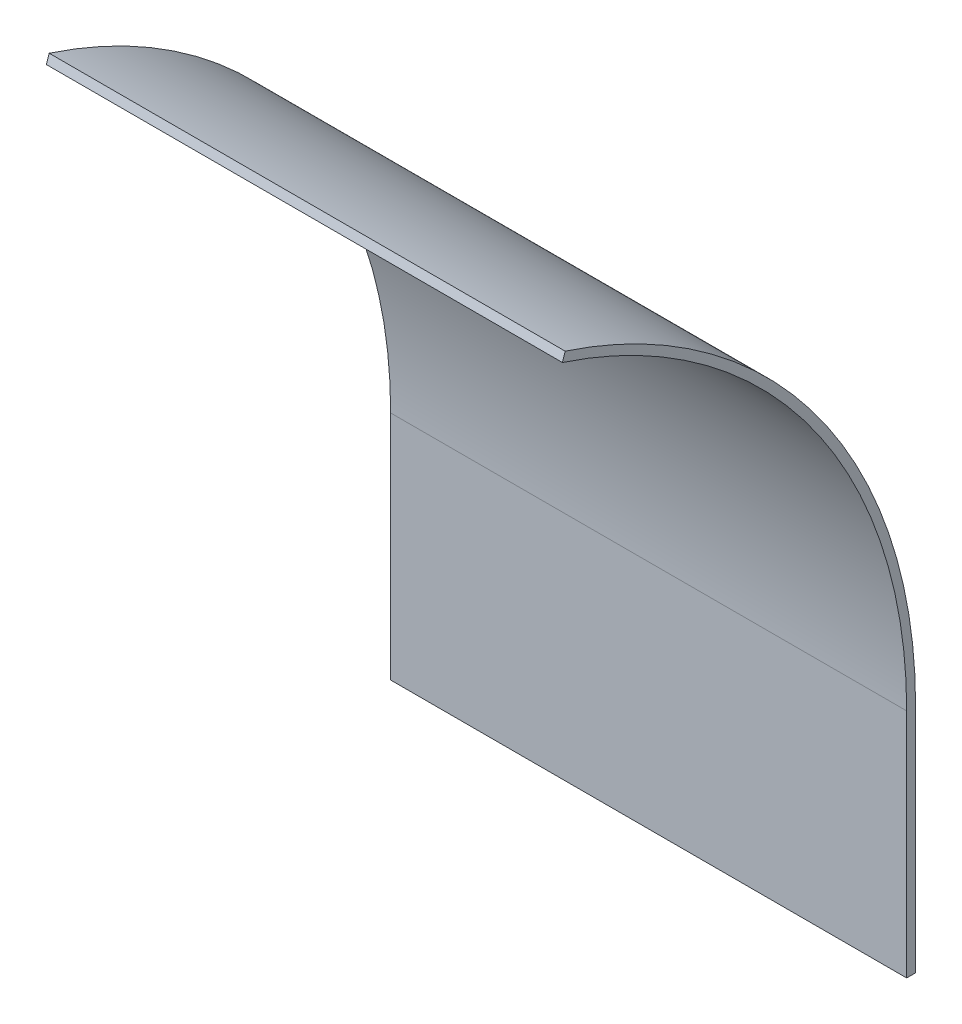
ISO-10303-21;
HEADER;
FILE_DESCRIPTION(('STEP AP214'),'2;1');
FILE_NAME('part.step','',(''),(''),'','','');
FILE_SCHEMA(('AUTOMOTIVE_DESIGN { 1 0 10303 214 1 1 1 1 }'));
ENDSEC;
DATA;
#1=APPLICATION_CONTEXT('core data for automotive mechanical design processes');
#2=APPLICATION_PROTOCOL_DEFINITION('international standard','automotive_design',2000,#1);
#3=PRODUCT_CONTEXT('',#1,'mechanical');
#4=PRODUCT('Part','Part','',(#3));
#5=PRODUCT_RELATED_PRODUCT_CATEGORY('part','',(#4));
#6=PRODUCT_DEFINITION_FORMATION('','',#4);
#7=PRODUCT_DEFINITION_CONTEXT('part definition',#1,'design');
#8=PRODUCT_DEFINITION('design','',#6,#7);
#9=PRODUCT_DEFINITION_SHAPE('','',#8);
#10=(LENGTH_UNIT() NAMED_UNIT(*) SI_UNIT(.MILLI.,.METRE.));
#11=(NAMED_UNIT(*) PLANE_ANGLE_UNIT() SI_UNIT($,.RADIAN.));
#12=(NAMED_UNIT(*) SI_UNIT($,.STERADIAN.) SOLID_ANGLE_UNIT());
#13=UNCERTAINTY_MEASURE_WITH_UNIT(LENGTH_MEASURE(1.E-05),#10,'distance_accuracy_value','');
#14=(GEOMETRIC_REPRESENTATION_CONTEXT(3) GLOBAL_UNCERTAINTY_ASSIGNED_CONTEXT((#13)) GLOBAL_UNIT_ASSIGNED_CONTEXT((#10,
#11,#12)) REPRESENTATION_CONTEXT('',''));
#15=CARTESIAN_POINT('',(0.,0.,0.));
#16=DIRECTION('',(0.,0.,1.));
#17=DIRECTION('',(1.,0.,0.));
#18=AXIS2_PLACEMENT_3D('',#15,#16,#17);
#19=CARTESIAN_POINT('',(92.075,0.,0.));
#20=DIRECTION('',(-1.,0.,0.));
#21=DIRECTION('',(0.,0.,1.));
#22=AXIS2_PLACEMENT_3D('',#19,#20,#21);
#23=CYLINDRICAL_SURFACE('',#22,177.8);
#24=DIRECTION('',(-1.,0.,0.));
#25=VECTOR('',#24,1.);
#26=CARTESIAN_POINT('',(92.075,0.,-177.8));
#27=LINE('',#26,#25);
#28=CARTESIAN_POINT('',(-92.075,0.,-177.8));
#29=VERTEX_POINT('',#28);
#30=CARTESIAN_POINT('',(92.075,0.,-177.8));
#31=VERTEX_POINT('',#30);
#32=EDGE_CURVE('E121',#29,#31,#27,.F.);
#33=ORIENTED_EDGE('',*,*,#32,.T.);
#34=CARTESIAN_POINT('',(92.075,0.,0.));
#35=DIRECTION('',(-1.,0.,0.));
#36=DIRECTION('',(0.,0.,1.));
#37=AXIS2_PLACEMENT_3D('',#34,#35,#36);
#38=CIRCLE('',#37,177.8);
#39=CARTESIAN_POINT('',(92.075,169.097848597278,-54.9432215998652));
#40=VERTEX_POINT('',#39);
#41=EDGE_CURVE('E105',#40,#31,#38,.T.);
#42=ORIENTED_EDGE('',*,*,#41,.F.);
#43=DIRECTION('',(1.,0.,0.));
#44=VECTOR('',#43,1.);
#45=CARTESIAN_POINT('',(92.075,169.097848597278,-54.9432215998652));
#46=LINE('',#45,#44);
#47=CARTESIAN_POINT('',(-92.075,169.097848597278,-54.9432215998652));
#48=VERTEX_POINT('',#47);
#49=EDGE_CURVE('E59',#40,#48,#46,.F.);
#50=ORIENTED_EDGE('',*,*,#49,.T.);
#51=CARTESIAN_POINT('',(-92.075,0.,0.));
#52=DIRECTION('',(-1.,0.,0.));
#53=DIRECTION('',(0.,0.,1.));
#54=AXIS2_PLACEMENT_3D('',#51,#52,#53);
#55=CIRCLE('',#54,177.8);
#56=EDGE_CURVE('E19',#48,#29,#55,.T.);
#57=ORIENTED_EDGE('',*,*,#56,.T.);
#58=EDGE_LOOP('',(#33,#42,#50,#57));
#59=FACE_BOUND('',#58,.T.);
#60=ADVANCED_FACE('F16',(#59),#23,.F.);
#61=CARTESIAN_POINT('',(92.075,0.,-177.8));
#62=DIRECTION('',(0.,0.,-1.));
#63=DIRECTION('',(-1.,0.,0.));
#64=AXIS2_PLACEMENT_3D('',#61,#62,#63);
#65=PLANE('',#64);
#66=DIRECTION('',(1.,0.,0.));
#67=VECTOR('',#66,1.);
#68=CARTESIAN_POINT('',(92.075,-82.55,-177.8));
#69=LINE('',#68,#67);
#70=CARTESIAN_POINT('',(-92.075,-82.55,-177.8));
#71=VERTEX_POINT('',#70);
#72=CARTESIAN_POINT('',(92.075,-82.55,-177.8));
#73=VERTEX_POINT('',#72);
#74=EDGE_CURVE('E107',#71,#73,#69,.T.);
#75=ORIENTED_EDGE('',*,*,#74,.T.);
#76=DIRECTION('',(0.,1.,0.));
#77=VECTOR('',#76,1.);
#78=CARTESIAN_POINT('',(92.075,0.,-177.8));
#79=LINE('',#78,#77);
#80=EDGE_CURVE('E91',#31,#73,#79,.F.);
#81=ORIENTED_EDGE('',*,*,#80,.F.);
#82=ORIENTED_EDGE('',*,*,#32,.F.);
#83=DIRECTION('',(0.,1.,0.));
#84=VECTOR('',#83,1.);
#85=CARTESIAN_POINT('',(-92.075,0.,-177.8));
#86=LINE('',#85,#84);
#87=EDGE_CURVE('E66',#29,#71,#86,.F.);
#88=ORIENTED_EDGE('',*,*,#87,.T.);
#89=EDGE_LOOP('',(#75,#81,#82,#88));
#90=FACE_BOUND('',#89,.T.);
#91=ADVANCED_FACE('F142',(#90),#65,.F.);
#92=CARTESIAN_POINT('',(92.075,-82.55,-177.8));
#93=DIRECTION('',(0.,1.,0.));
#94=DIRECTION('',(0.,0.,1.));
#95=AXIS2_PLACEMENT_3D('',#92,#93,#94);
#96=PLANE('',#95);
#97=DIRECTION('',(1.,0.,0.));
#98=VECTOR('',#97,1.);
#99=CARTESIAN_POINT('',(92.075,-82.55,-180.975));
#100=LINE('',#99,#98);
#101=CARTESIAN_POINT('',(-92.075,-82.55,-180.975));
#102=VERTEX_POINT('',#101);
#103=CARTESIAN_POINT('',(92.075,-82.55,-180.975));
#104=VERTEX_POINT('',#103);
#105=EDGE_CURVE('E77',#102,#104,#100,.T.);
#106=ORIENTED_EDGE('',*,*,#105,.T.);
#107=DIRECTION('',(0.,0.,-1.));
#108=VECTOR('',#107,1.);
#109=CARTESIAN_POINT('',(92.075,-82.55,0.));
#110=LINE('',#109,#108);
#111=EDGE_CURVE('E79',#73,#104,#110,.T.);
#112=ORIENTED_EDGE('',*,*,#111,.F.);
#113=ORIENTED_EDGE('',*,*,#74,.F.);
#114=DIRECTION('',(0.,0.,-1.));
#115=VECTOR('',#114,1.);
#116=CARTESIAN_POINT('',(-92.075,-82.55,0.));
#117=LINE('',#116,#115);
#118=EDGE_CURVE('E82',#71,#102,#117,.T.);
#119=ORIENTED_EDGE('',*,*,#118,.T.);
#120=EDGE_LOOP('',(#106,#112,#113,#119));
#121=FACE_BOUND('',#120,.T.);
#122=ADVANCED_FACE('F78',(#121),#96,.F.);
#123=CARTESIAN_POINT('',(-92.075,0.,0.));
#124=DIRECTION('',(1.,0.,0.));
#125=DIRECTION('',(0.,0.,-1.));
#126=AXIS2_PLACEMENT_3D('',#123,#124,#125);
#127=PLANE('',#126);
#128=DIRECTION('',(0.,0.951056516295156,-0.309016994374939));
#129=VECTOR('',#128,1.);
#130=CARTESIAN_POINT('',(-92.0750000000001,169.097848597278,-54.9432215998652));
#131=LINE('',#130,#129);
#132=CARTESIAN_POINT('',(-92.075,172.117453036516,-55.9243505570056));
#133=VERTEX_POINT('',#132);
#134=EDGE_CURVE('E103',#48,#133,#131,.T.);
#135=ORIENTED_EDGE('',*,*,#134,.T.);
#136=CARTESIAN_POINT('',(-92.075,0.,0.));
#137=DIRECTION('',(-1.,0.,0.));
#138=DIRECTION('',(0.,0.,1.));
#139=AXIS2_PLACEMENT_3D('',#136,#137,#138);
#140=CIRCLE('',#139,180.975);
#141=CARTESIAN_POINT('',(-92.075,0.,-180.975));
#142=VERTEX_POINT('',#141);
#143=EDGE_CURVE('E97',#142,#133,#140,.F.);
#144=ORIENTED_EDGE('',*,*,#143,.F.);
#145=DIRECTION('',(0.,1.,0.));
#146=VECTOR('',#145,1.);
#147=CARTESIAN_POINT('',(-92.075,-82.55,-180.975));
#148=LINE('',#147,#146);
#149=EDGE_CURVE('E95',#142,#102,#148,.F.);
#150=ORIENTED_EDGE('',*,*,#149,.T.);
#151=ORIENTED_EDGE('',*,*,#118,.F.);
#152=ORIENTED_EDGE('',*,*,#87,.F.);
#153=ORIENTED_EDGE('',*,*,#56,.F.);
#154=EDGE_LOOP('',(#135,#144,#150,#151,#152,#153));
#155=FACE_BOUND('',#154,.T.);
#156=ADVANCED_FACE('F141',(#155),#127,.F.);
#157=CARTESIAN_POINT('',(92.075,169.097848597278,-54.9432215998652));
#158=DIRECTION('',(0.,-0.309016994374939,-0.951056516295156));
#159=DIRECTION('',(0.,0.951056516295156,-0.309016994374939));
#160=AXIS2_PLACEMENT_3D('',#157,#158,#159);
#161=PLANE('',#160);
#162=ORIENTED_EDGE('',*,*,#49,.F.);
#163=DIRECTION('',(0.,-0.951056516295154,0.309016994374945));
#164=VECTOR('',#163,1.);
#165=CARTESIAN_POINT('',(92.075,172.117453036516,-55.9243505570056));
#166=LINE('',#165,#164);
#167=CARTESIAN_POINT('',(92.075,172.117453036516,-55.9243505570056));
#168=VERTEX_POINT('',#167);
#169=EDGE_CURVE('E86',#168,#40,#166,.T.);
#170=ORIENTED_EDGE('',*,*,#169,.F.);
#171=DIRECTION('',(-1.,0.,0.));
#172=VECTOR('',#171,1.);
#173=CARTESIAN_POINT('',(92.075,172.117453036516,-55.9243505570056));
#174=LINE('',#173,#172);
#175=EDGE_CURVE('E126',#133,#168,#174,.F.);
#176=ORIENTED_EDGE('',*,*,#175,.F.);
#177=ORIENTED_EDGE('',*,*,#134,.F.);
#178=EDGE_LOOP('',(#162,#170,#176,#177));
#179=FACE_BOUND('',#178,.T.);
#180=ADVANCED_FACE('F139',(#179),#161,.F.);
#181=CARTESIAN_POINT('',(92.075,0.,0.));
#182=DIRECTION('',(1.,0.,0.));
#183=DIRECTION('',(0.,0.,-1.));
#184=AXIS2_PLACEMENT_3D('',#181,#182,#183);
#185=PLANE('',#184);
#186=CARTESIAN_POINT('',(92.075,0.,0.));
#187=DIRECTION('',(-1.,0.,0.));
#188=DIRECTION('',(0.,0.,1.));
#189=AXIS2_PLACEMENT_3D('',#186,#187,#188);
#190=CIRCLE('',#189,180.975);
#191=CARTESIAN_POINT('',(92.075,0.,-180.975));
#192=VERTEX_POINT('',#191);
#193=EDGE_CURVE('E25',#168,#192,#190,.T.);
#194=ORIENTED_EDGE('',*,*,#193,.F.);
#195=ORIENTED_EDGE('',*,*,#169,.T.);
#196=ORIENTED_EDGE('',*,*,#41,.T.);
#197=ORIENTED_EDGE('',*,*,#80,.T.);
#198=ORIENTED_EDGE('',*,*,#111,.T.);
#199=DIRECTION('',(0.,1.,0.));
#200=VECTOR('',#199,1.);
#201=CARTESIAN_POINT('',(92.075,-82.55,-180.975));
#202=LINE('',#201,#200);
#203=EDGE_CURVE('E34',#104,#192,#202,.T.);
#204=ORIENTED_EDGE('',*,*,#203,.T.);
#205=EDGE_LOOP('',(#194,#195,#196,#197,#198,#204));
#206=FACE_BOUND('',#205,.T.);
#207=ADVANCED_FACE('F88',(#206),#185,.T.);
#208=CARTESIAN_POINT('',(92.075,-82.55,-180.975));
#209=DIRECTION('',(0.,0.,1.));
#210=DIRECTION('',(1.,0.,0.));
#211=AXIS2_PLACEMENT_3D('',#208,#209,#210);
#212=PLANE('',#211);
#213=DIRECTION('',(-1.,0.,0.));
#214=VECTOR('',#213,1.);
#215=CARTESIAN_POINT('',(92.075,0.,-180.975));
#216=LINE('',#215,#214);
#217=EDGE_CURVE('E11',#192,#142,#216,.T.);
#218=ORIENTED_EDGE('',*,*,#217,.F.);
#219=ORIENTED_EDGE('',*,*,#203,.F.);
#220=ORIENTED_EDGE('',*,*,#105,.F.);
#221=ORIENTED_EDGE('',*,*,#149,.F.);
#222=EDGE_LOOP('',(#218,#219,#220,#221));
#223=FACE_BOUND('',#222,.T.);
#224=ADVANCED_FACE('F93',(#223),#212,.F.);
#225=CARTESIAN_POINT('',(92.075,0.,0.));
#226=DIRECTION('',(-1.,0.,0.));
#227=DIRECTION('',(0.,0.,1.));
#228=AXIS2_PLACEMENT_3D('',#225,#226,#227);
#229=CYLINDRICAL_SURFACE('',#228,180.975);
#230=ORIENTED_EDGE('',*,*,#193,.T.);
#231=ORIENTED_EDGE('',*,*,#217,.T.);
#232=ORIENTED_EDGE('',*,*,#143,.T.);
#233=ORIENTED_EDGE('',*,*,#175,.T.);
#234=EDGE_LOOP('',(#230,#231,#232,#233));
#235=FACE_BOUND('',#234,.T.);
#236=ADVANCED_FACE('F136',(#235),#229,.T.);
#237=CLOSED_SHELL('',(#60,#91,#122,#156,#180,#207,#224,#236));
#238=MANIFOLD_SOLID_BREP('B1',#237);
#239=ADVANCED_BREP_SHAPE_REPRESENTATION('',(#18,#238),#14);
#240=SHAPE_DEFINITION_REPRESENTATION(#9,#239);
ENDSEC;
END-ISO-10303-21;
